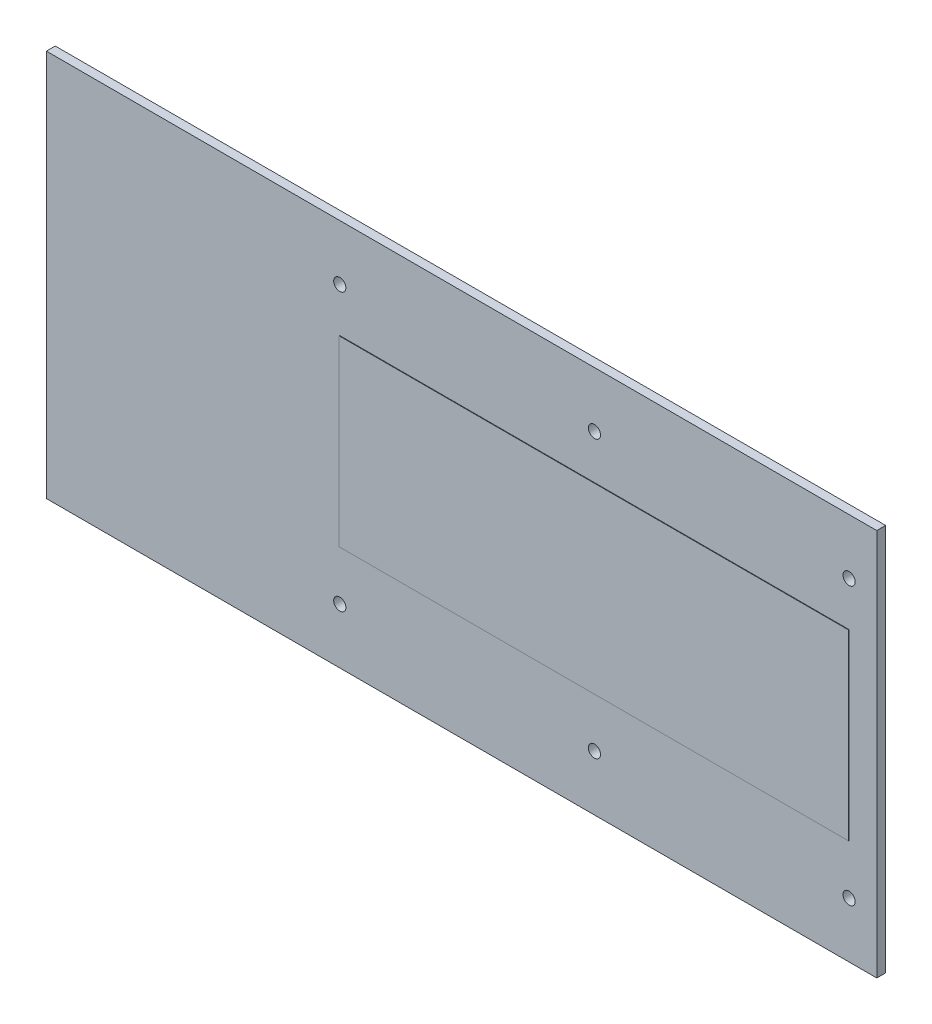
ISO-10303-21;
HEADER;
FILE_DESCRIPTION(('STEP AP214'),'2;1');
FILE_NAME('part.step','',(''),(''),'','','');
FILE_SCHEMA(('AUTOMOTIVE_DESIGN { 1 0 10303 214 1 1 1 1 }'));
ENDSEC;
DATA;
#1=APPLICATION_CONTEXT('core data for automotive mechanical design processes');
#2=APPLICATION_PROTOCOL_DEFINITION('international standard','automotive_design',2000,#1);
#3=PRODUCT_CONTEXT('',#1,'mechanical');
#4=PRODUCT('Part','Part','',(#3));
#5=PRODUCT_RELATED_PRODUCT_CATEGORY('part','',(#4));
#6=PRODUCT_DEFINITION_FORMATION('','',#4);
#7=PRODUCT_DEFINITION_CONTEXT('part definition',#1,'design');
#8=PRODUCT_DEFINITION('design','',#6,#7);
#9=PRODUCT_DEFINITION_SHAPE('','',#8);
#10=(LENGTH_UNIT() NAMED_UNIT(*) SI_UNIT(.MILLI.,.METRE.));
#11=(NAMED_UNIT(*) PLANE_ANGLE_UNIT() SI_UNIT($,.RADIAN.));
#12=(NAMED_UNIT(*) SI_UNIT($,.STERADIAN.) SOLID_ANGLE_UNIT());
#13=UNCERTAINTY_MEASURE_WITH_UNIT(LENGTH_MEASURE(1.E-05),#10,'distance_accuracy_value','');
#14=(GEOMETRIC_REPRESENTATION_CONTEXT(3) GLOBAL_UNCERTAINTY_ASSIGNED_CONTEXT((#13)) GLOBAL_UNIT_ASSIGNED_CONTEXT((#10,
#11,#12)) REPRESENTATION_CONTEXT('',''));
#15=CARTESIAN_POINT('',(0.,0.,0.));
#16=DIRECTION('',(0.,0.,1.));
#17=DIRECTION('',(1.,0.,0.));
#18=AXIS2_PLACEMENT_3D('',#15,#16,#17);
#19=CARTESIAN_POINT('',(53.,52.,1.7));
#20=DIRECTION('',(1.,0.,0.));
#21=DIRECTION('',(0.,0.,-1.));
#22=AXIS2_PLACEMENT_3D('',#19,#20,#21);
#23=PLANE('',#22);
#24=DIRECTION('',(0.,-1.,0.));
#25=VECTOR('',#24,1.);
#26=CARTESIAN_POINT('',(53.,52.,1.6));
#27=LINE('',#26,#25);
#28=CARTESIAN_POINT('',(53.,52.,1.6));
#29=VERTEX_POINT('',#28);
#30=CARTESIAN_POINT('',(53.,19.,1.6));
#31=VERTEX_POINT('',#30);
#32=EDGE_CURVE('E108',#29,#31,#27,.T.);
#33=ORIENTED_EDGE('',*,*,#32,.T.);
#34=DIRECTION('',(0.,0.,-1.));
#35=VECTOR('',#34,1.);
#36=CARTESIAN_POINT('',(53.,19.,1.7));
#37=LINE('',#36,#35);
#38=CARTESIAN_POINT('',(53.,19.,1.7));
#39=VERTEX_POINT('',#38);
#40=EDGE_CURVE('E12',#39,#31,#37,.T.);
#41=ORIENTED_EDGE('',*,*,#40,.F.);
#42=DIRECTION('',(0.,-1.,0.));
#43=VECTOR('',#42,1.);
#44=CARTESIAN_POINT('',(53.,52.,1.7));
#45=LINE('',#44,#43);
#46=CARTESIAN_POINT('',(53.,52.,1.7));
#47=VERTEX_POINT('',#46);
#48=EDGE_CURVE('E96',#47,#39,#45,.T.);
#49=ORIENTED_EDGE('',*,*,#48,.F.);
#50=DIRECTION('',(0.,0.,-1.));
#51=VECTOR('',#50,1.);
#52=CARTESIAN_POINT('',(53.,52.,1.7));
#53=LINE('',#52,#51);
#54=EDGE_CURVE('E104',#47,#29,#53,.T.);
#55=ORIENTED_EDGE('',*,*,#54,.T.);
#56=EDGE_LOOP('',(#33,#41,#49,#55));
#57=FACE_BOUND('',#56,.T.);
#58=ADVANCED_FACE('F45',(#57),#23,.F.);
#59=CARTESIAN_POINT('',(53.,19.,1.7));
#60=DIRECTION('',(0.,1.,0.));
#61=DIRECTION('',(0.,0.,1.));
#62=AXIS2_PLACEMENT_3D('',#59,#60,#61);
#63=PLANE('',#62);
#64=DIRECTION('',(1.,0.,0.));
#65=VECTOR('',#64,1.);
#66=CARTESIAN_POINT('',(53.,19.,1.6));
#67=LINE('',#66,#65);
#68=CARTESIAN_POINT('',(145.,19.,1.6));
#69=VERTEX_POINT('',#68);
#70=EDGE_CURVE('E100',#31,#69,#67,.T.);
#71=ORIENTED_EDGE('',*,*,#70,.T.);
#72=DIRECTION('',(0.,0.,-1.));
#73=VECTOR('',#72,1.);
#74=CARTESIAN_POINT('',(145.,19.,1.7));
#75=LINE('',#74,#73);
#76=CARTESIAN_POINT('',(145.,19.,1.7));
#77=VERTEX_POINT('',#76);
#78=EDGE_CURVE('E53',#77,#69,#75,.T.);
#79=ORIENTED_EDGE('',*,*,#78,.F.);
#80=DIRECTION('',(1.,0.,0.));
#81=VECTOR('',#80,1.);
#82=CARTESIAN_POINT('',(53.,19.,1.7));
#83=LINE('',#82,#81);
#84=EDGE_CURVE('E91',#39,#77,#83,.T.);
#85=ORIENTED_EDGE('',*,*,#84,.F.);
#86=ORIENTED_EDGE('',*,*,#40,.T.);
#87=EDGE_LOOP('',(#71,#79,#85,#86));
#88=FACE_BOUND('',#87,.T.);
#89=ADVANCED_FACE('F99',(#88),#63,.F.);
#90=CARTESIAN_POINT('',(145.,52.,1.7));
#91=DIRECTION('',(-1.,0.,0.));
#92=DIRECTION('',(0.,0.,1.));
#93=AXIS2_PLACEMENT_3D('',#90,#91,#92);
#94=PLANE('',#93);
#95=DIRECTION('',(0.,1.,0.));
#96=VECTOR('',#95,1.);
#97=CARTESIAN_POINT('',(145.,52.,1.6));
#98=LINE('',#97,#96);
#99=CARTESIAN_POINT('',(145.,52.,1.6));
#100=VERTEX_POINT('',#99);
#101=EDGE_CURVE('E78',#69,#100,#98,.T.);
#102=ORIENTED_EDGE('',*,*,#101,.T.);
#103=DIRECTION('',(0.,0.,-1.));
#104=VECTOR('',#103,1.);
#105=CARTESIAN_POINT('',(145.,52.,1.7));
#106=LINE('',#105,#104);
#107=CARTESIAN_POINT('',(145.,52.,1.7));
#108=VERTEX_POINT('',#107);
#109=EDGE_CURVE('E101',#108,#100,#106,.T.);
#110=ORIENTED_EDGE('',*,*,#109,.F.);
#111=DIRECTION('',(0.,1.,0.));
#112=VECTOR('',#111,1.);
#113=CARTESIAN_POINT('',(145.,52.,1.7));
#114=LINE('',#113,#112);
#115=EDGE_CURVE('E94',#77,#108,#114,.T.);
#116=ORIENTED_EDGE('',*,*,#115,.F.);
#117=ORIENTED_EDGE('',*,*,#78,.T.);
#118=EDGE_LOOP('',(#102,#110,#116,#117));
#119=FACE_BOUND('',#118,.T.);
#120=ADVANCED_FACE('F102',(#119),#94,.F.);
#121=CARTESIAN_POINT('',(53.,52.,1.7));
#122=DIRECTION('',(0.,-1.,0.));
#123=DIRECTION('',(0.,0.,-1.));
#124=AXIS2_PLACEMENT_3D('',#121,#122,#123);
#125=PLANE('',#124);
#126=DIRECTION('',(-1.,0.,0.));
#127=VECTOR('',#126,1.);
#128=CARTESIAN_POINT('',(53.,52.,1.6));
#129=LINE('',#128,#127);
#130=EDGE_CURVE('E84',#100,#29,#129,.T.);
#131=ORIENTED_EDGE('',*,*,#130,.T.);
#132=ORIENTED_EDGE('',*,*,#54,.F.);
#133=DIRECTION('',(-1.,0.,0.));
#134=VECTOR('',#133,1.);
#135=CARTESIAN_POINT('',(53.,52.,1.7));
#136=LINE('',#135,#134);
#137=EDGE_CURVE('E61',#108,#47,#136,.T.);
#138=ORIENTED_EDGE('',*,*,#137,.F.);
#139=ORIENTED_EDGE('',*,*,#109,.T.);
#140=EDGE_LOOP('',(#131,#132,#138,#139));
#141=FACE_BOUND('',#140,.T.);
#142=ADVANCED_FACE('F115',(#141),#125,.F.);
#143=CARTESIAN_POINT('',(0.,0.,1.7));
#144=DIRECTION('',(0.,0.,1.));
#145=DIRECTION('',(1.,0.,0.));
#146=AXIS2_PLACEMENT_3D('',#143,#144,#145);
#147=PLANE('',#146);
#148=ORIENTED_EDGE('',*,*,#48,.T.);
#149=ORIENTED_EDGE('',*,*,#84,.T.);
#150=ORIENTED_EDGE('',*,*,#115,.T.);
#151=ORIENTED_EDGE('',*,*,#137,.T.);
#152=EDGE_LOOP('',(#148,#149,#150,#151));
#153=FACE_BOUND('',#152,.T.);
#154=ADVANCED_FACE('F92',(#153),#147,.T.);
#155=CARTESIAN_POINT('',(0.,0.,1.6));
#156=DIRECTION('',(0.,0.,1.));
#157=DIRECTION('',(1.,0.,0.));
#158=AXIS2_PLACEMENT_3D('',#155,#156,#157);
#159=PLANE('',#158);
#160=ORIENTED_EDGE('',*,*,#32,.F.);
#161=ORIENTED_EDGE('',*,*,#130,.F.);
#162=ORIENTED_EDGE('',*,*,#101,.F.);
#163=ORIENTED_EDGE('',*,*,#70,.F.);
#164=EDGE_LOOP('',(#160,#161,#162,#163));
#165=FACE_BOUND('',#164,.T.);
#166=ADVANCED_FACE('F118',(#165),#159,.F.);
#167=CLOSED_SHELL('',(#58,#89,#120,#142,#154,#166));
#168=MANIFOLD_SOLID_BREP('B2',#167);
#169=CARTESIAN_POINT('',(0.,0.,1.6));
#170=DIRECTION('',(0.,0.,-1.));
#171=DIRECTION('',(-1.,0.,0.));
#172=AXIS2_PLACEMENT_3D('',#169,#170,#171);
#173=PLANE('',#172);
#174=CARTESIAN_POINT('',(145.,60.,1.6));
#175=DIRECTION('',(0.,0.,1.));
#176=DIRECTION('',(1.,0.,0.));
#177=AXIS2_PLACEMENT_3D('',#174,#175,#176);
#178=CIRCLE('',#177,1.1);
#179=CARTESIAN_POINT('',(146.1,60.,1.6));
#180=VERTEX_POINT('',#179);
#181=EDGE_CURVE('E270',#180,#180,#178,.T.);
#182=ORIENTED_EDGE('',*,*,#181,.F.);
#183=EDGE_LOOP('',(#182));
#184=FACE_BOUND('',#183,.T.);
#185=CARTESIAN_POINT('',(145.,10.,1.6));
#186=DIRECTION('',(0.,0.,1.));
#187=DIRECTION('',(1.,0.,0.));
#188=AXIS2_PLACEMENT_3D('',#185,#186,#187);
#189=CIRCLE('',#188,1.1);
#190=CARTESIAN_POINT('',(146.1,10.,1.6));
#191=VERTEX_POINT('',#190);
#192=EDGE_CURVE('E276',#191,#191,#189,.T.);
#193=ORIENTED_EDGE('',*,*,#192,.F.);
#194=EDGE_LOOP('',(#193));
#195=FACE_BOUND('',#194,.T.);
#196=CARTESIAN_POINT('',(53.,60.,1.6));
#197=DIRECTION('',(0.,0.,1.));
#198=DIRECTION('',(1.,0.,0.));
#199=AXIS2_PLACEMENT_3D('',#196,#197,#198);
#200=CIRCLE('',#199,1.1);
#201=CARTESIAN_POINT('',(54.1,60.,1.6));
#202=VERTEX_POINT('',#201);
#203=EDGE_CURVE('E282',#202,#202,#200,.T.);
#204=ORIENTED_EDGE('',*,*,#203,.F.);
#205=EDGE_LOOP('',(#204));
#206=FACE_BOUND('',#205,.T.);
#207=CARTESIAN_POINT('',(99.,60.,1.6));
#208=DIRECTION('',(0.,0.,1.));
#209=DIRECTION('',(1.,0.,0.));
#210=AXIS2_PLACEMENT_3D('',#207,#208,#209);
#211=CIRCLE('',#210,1.1);
#212=CARTESIAN_POINT('',(100.1,60.,1.6));
#213=VERTEX_POINT('',#212);
#214=EDGE_CURVE('E288',#213,#213,#211,.T.);
#215=ORIENTED_EDGE('',*,*,#214,.F.);
#216=EDGE_LOOP('',(#215));
#217=FACE_BOUND('',#216,.T.);
#218=CARTESIAN_POINT('',(53.,10.,1.6));
#219=DIRECTION('',(0.,0.,1.));
#220=DIRECTION('',(1.,0.,0.));
#221=AXIS2_PLACEMENT_3D('',#218,#219,#220);
#222=CIRCLE('',#221,1.1);
#223=CARTESIAN_POINT('',(54.1,10.,1.6));
#224=VERTEX_POINT('',#223);
#225=EDGE_CURVE('E294',#224,#224,#222,.T.);
#226=ORIENTED_EDGE('',*,*,#225,.F.);
#227=EDGE_LOOP('',(#226));
#228=FACE_BOUND('',#227,.T.);
#229=CARTESIAN_POINT('',(99.,10.,1.6));
#230=DIRECTION('',(0.,0.,1.));
#231=DIRECTION('',(1.,0.,0.));
#232=AXIS2_PLACEMENT_3D('',#229,#230,#231);
#233=CIRCLE('',#232,1.1);
#234=CARTESIAN_POINT('',(100.1,10.,1.6));
#235=VERTEX_POINT('',#234);
#236=EDGE_CURVE('E300',#235,#235,#233,.T.);
#237=ORIENTED_EDGE('',*,*,#236,.F.);
#238=EDGE_LOOP('',(#237));
#239=FACE_BOUND('',#238,.T.);
#240=DIRECTION('',(-1.,0.,0.));
#241=VECTOR('',#240,1.);
#242=CARTESIAN_POINT('',(0.,70.,1.6));
#243=LINE('',#242,#241);
#244=CARTESIAN_POINT('',(150.,70.,1.6));
#245=VERTEX_POINT('',#244);
#246=CARTESIAN_POINT('',(0.,70.,1.6));
#247=VERTEX_POINT('',#246);
#248=EDGE_CURVE('E306',#245,#247,#243,.T.);
#249=ORIENTED_EDGE('',*,*,#248,.T.);
#250=DIRECTION('',(0.,-1.,0.));
#251=VECTOR('',#250,1.);
#252=CARTESIAN_POINT('',(0.,47.,1.6));
#253=LINE('',#252,#251);
#254=CARTESIAN_POINT('',(0.,0.,1.6));
#255=VERTEX_POINT('',#254);
#256=EDGE_CURVE('E309',#247,#255,#253,.T.);
#257=ORIENTED_EDGE('',*,*,#256,.T.);
#258=DIRECTION('',(1.,0.,0.));
#259=VECTOR('',#258,1.);
#260=CARTESIAN_POINT('',(46.,0.,1.6));
#261=LINE('',#260,#259);
#262=CARTESIAN_POINT('',(150.,0.,1.6));
#263=VERTEX_POINT('',#262);
#264=EDGE_CURVE('E312',#255,#263,#261,.T.);
#265=ORIENTED_EDGE('',*,*,#264,.T.);
#266=DIRECTION('',(0.,1.,0.));
#267=VECTOR('',#266,1.);
#268=CARTESIAN_POINT('',(150.,70.,1.6));
#269=LINE('',#268,#267);
#270=EDGE_CURVE('E314',#263,#245,#269,.T.);
#271=ORIENTED_EDGE('',*,*,#270,.T.);
#272=EDGE_LOOP('',(#249,#257,#265,#271));
#273=FACE_BOUND('',#272,.T.);
#274=DIRECTION('',(1.,0.,0.));
#275=VECTOR('',#274,1.);
#276=CARTESIAN_POINT('',(53.,19.,1.6));
#277=LINE('',#276,#275);
#278=CARTESIAN_POINT('',(53.,19.,1.6));
#279=VERTEX_POINT('',#278);
#280=CARTESIAN_POINT('',(145.,19.,1.6));
#281=VERTEX_POINT('',#280);
#282=EDGE_CURVE('E234',#279,#281,#277,.T.);
#283=ORIENTED_EDGE('',*,*,#282,.F.);
#284=DIRECTION('',(0.,-1.,0.));
#285=VECTOR('',#284,1.);
#286=CARTESIAN_POINT('',(53.,52.,1.6));
#287=LINE('',#286,#285);
#288=CARTESIAN_POINT('',(53.,52.,1.6));
#289=VERTEX_POINT('',#288);
#290=EDGE_CURVE('E256',#289,#279,#287,.T.);
#291=ORIENTED_EDGE('',*,*,#290,.F.);
#292=DIRECTION('',(-1.,0.,0.));
#293=VECTOR('',#292,1.);
#294=CARTESIAN_POINT('',(145.,52.,1.6));
#295=LINE('',#294,#293);
#296=CARTESIAN_POINT('',(145.,52.,1.6));
#297=VERTEX_POINT('',#296);
#298=EDGE_CURVE('E254',#297,#289,#295,.T.);
#299=ORIENTED_EDGE('',*,*,#298,.F.);
#300=DIRECTION('',(0.,1.,0.));
#301=VECTOR('',#300,1.);
#302=CARTESIAN_POINT('',(145.,19.,1.6));
#303=LINE('',#302,#301);
#304=EDGE_CURVE('E242',#281,#297,#303,.T.);
#305=ORIENTED_EDGE('',*,*,#304,.F.);
#306=EDGE_LOOP('',(#283,#291,#299,#305));
#307=FACE_BOUND('',#306,.T.);
#308=ADVANCED_FACE('F169',(#184,#195,#206,#217,#228,#239,#273,#307),#173,.F.);
#309=CARTESIAN_POINT('',(0.,0.,0.));
#310=DIRECTION('',(0.,0.,-1.));
#311=DIRECTION('',(-1.,0.,0.));
#312=AXIS2_PLACEMENT_3D('',#309,#310,#311);
#313=PLANE('',#312);
#314=CARTESIAN_POINT('',(145.,10.,0.));
#315=DIRECTION('',(0.,0.,1.));
#316=DIRECTION('',(1.,0.,0.));
#317=AXIS2_PLACEMENT_3D('',#314,#315,#316);
#318=CIRCLE('',#317,1.1);
#319=CARTESIAN_POINT('',(146.1,10.,0.));
#320=VERTEX_POINT('',#319);
#321=EDGE_CURVE('E273',#320,#320,#318,.T.);
#322=ORIENTED_EDGE('',*,*,#321,.T.);
#323=EDGE_LOOP('',(#322));
#324=FACE_BOUND('',#323,.T.);
#325=CARTESIAN_POINT('',(99.,60.,0.));
#326=DIRECTION('',(0.,0.,1.));
#327=DIRECTION('',(1.,0.,0.));
#328=AXIS2_PLACEMENT_3D('',#325,#326,#327);
#329=CIRCLE('',#328,1.1);
#330=CARTESIAN_POINT('',(100.1,60.,0.));
#331=VERTEX_POINT('',#330);
#332=EDGE_CURVE('E285',#331,#331,#329,.T.);
#333=ORIENTED_EDGE('',*,*,#332,.T.);
#334=EDGE_LOOP('',(#333));
#335=FACE_BOUND('',#334,.T.);
#336=CARTESIAN_POINT('',(99.,10.,0.));
#337=DIRECTION('',(0.,0.,1.));
#338=DIRECTION('',(1.,0.,0.));
#339=AXIS2_PLACEMENT_3D('',#336,#337,#338);
#340=CIRCLE('',#339,1.1);
#341=CARTESIAN_POINT('',(100.1,10.,0.));
#342=VERTEX_POINT('',#341);
#343=EDGE_CURVE('E297',#342,#342,#340,.T.);
#344=ORIENTED_EDGE('',*,*,#343,.T.);
#345=EDGE_LOOP('',(#344));
#346=FACE_BOUND('',#345,.T.);
#347=DIRECTION('',(0.,-1.,0.));
#348=VECTOR('',#347,1.);
#349=CARTESIAN_POINT('',(0.,0.,0.));
#350=LINE('',#349,#348);
#351=CARTESIAN_POINT('',(0.,70.,0.));
#352=VERTEX_POINT('',#351);
#353=CARTESIAN_POINT('',(0.,0.,0.));
#354=VERTEX_POINT('',#353);
#355=EDGE_CURVE('E303',#352,#354,#350,.T.);
#356=ORIENTED_EDGE('',*,*,#355,.F.);
#357=DIRECTION('',(-1.,0.,0.));
#358=VECTOR('',#357,1.);
#359=CARTESIAN_POINT('',(48.,70.,0.));
#360=LINE('',#359,#358);
#361=CARTESIAN_POINT('',(150.,70.,0.));
#362=VERTEX_POINT('',#361);
#363=EDGE_CURVE('E310',#362,#352,#360,.T.);
#364=ORIENTED_EDGE('',*,*,#363,.F.);
#365=DIRECTION('',(0.,1.,0.));
#366=VECTOR('',#365,1.);
#367=CARTESIAN_POINT('',(150.,70.,0.));
#368=LINE('',#367,#366);
#369=CARTESIAN_POINT('',(150.,0.,0.));
#370=VERTEX_POINT('',#369);
#371=EDGE_CURVE('E322',#370,#362,#368,.T.);
#372=ORIENTED_EDGE('',*,*,#371,.F.);
#373=DIRECTION('',(1.,0.,0.));
#374=VECTOR('',#373,1.);
#375=CARTESIAN_POINT('',(150.,0.,0.));
#376=LINE('',#375,#374);
#377=EDGE_CURVE('E320',#354,#370,#376,.T.);
#378=ORIENTED_EDGE('',*,*,#377,.F.);
#379=EDGE_LOOP('',(#356,#364,#372,#378));
#380=FACE_BOUND('',#379,.T.);
#381=CARTESIAN_POINT('',(53.,10.,0.));
#382=DIRECTION('',(0.,0.,1.));
#383=DIRECTION('',(1.,0.,0.));
#384=AXIS2_PLACEMENT_3D('',#381,#382,#383);
#385=CIRCLE('',#384,1.1);
#386=CARTESIAN_POINT('',(54.1,10.,0.));
#387=VERTEX_POINT('',#386);
#388=EDGE_CURVE('E291',#387,#387,#385,.T.);
#389=ORIENTED_EDGE('',*,*,#388,.T.);
#390=EDGE_LOOP('',(#389));
#391=FACE_BOUND('',#390,.T.);
#392=CARTESIAN_POINT('',(53.,60.,0.));
#393=DIRECTION('',(0.,0.,1.));
#394=DIRECTION('',(1.,0.,0.));
#395=AXIS2_PLACEMENT_3D('',#392,#393,#394);
#396=CIRCLE('',#395,1.1);
#397=CARTESIAN_POINT('',(54.1,60.,0.));
#398=VERTEX_POINT('',#397);
#399=EDGE_CURVE('E279',#398,#398,#396,.T.);
#400=ORIENTED_EDGE('',*,*,#399,.T.);
#401=EDGE_LOOP('',(#400));
#402=FACE_BOUND('',#401,.T.);
#403=CARTESIAN_POINT('',(145.,60.,0.));
#404=DIRECTION('',(0.,0.,1.));
#405=DIRECTION('',(1.,0.,0.));
#406=AXIS2_PLACEMENT_3D('',#403,#404,#405);
#407=CIRCLE('',#406,1.1);
#408=CARTESIAN_POINT('',(146.1,60.,0.));
#409=VERTEX_POINT('',#408);
#410=EDGE_CURVE('E250',#409,#409,#407,.T.);
#411=ORIENTED_EDGE('',*,*,#410,.T.);
#412=EDGE_LOOP('',(#411));
#413=FACE_BOUND('',#412,.T.);
#414=DIRECTION('',(0.,-1.,0.));
#415=VECTOR('',#414,1.);
#416=CARTESIAN_POINT('',(53.,52.,0.));
#417=LINE('',#416,#415);
#418=CARTESIAN_POINT('',(53.,52.,0.));
#419=VERTEX_POINT('',#418);
#420=CARTESIAN_POINT('',(53.,19.,0.));
#421=VERTEX_POINT('',#420);
#422=EDGE_CURVE('E243',#419,#421,#417,.T.);
#423=ORIENTED_EDGE('',*,*,#422,.T.);
#424=DIRECTION('',(1.,0.,0.));
#425=VECTOR('',#424,1.);
#426=CARTESIAN_POINT('',(53.,19.,0.));
#427=LINE('',#426,#425);
#428=CARTESIAN_POINT('',(145.,19.,0.));
#429=VERTEX_POINT('',#428);
#430=EDGE_CURVE('E192',#421,#429,#427,.T.);
#431=ORIENTED_EDGE('',*,*,#430,.T.);
#432=DIRECTION('',(0.,1.,0.));
#433=VECTOR('',#432,1.);
#434=CARTESIAN_POINT('',(145.,19.,0.));
#435=LINE('',#434,#433);
#436=CARTESIAN_POINT('',(145.,52.,0.));
#437=VERTEX_POINT('',#436);
#438=EDGE_CURVE('E249',#429,#437,#435,.T.);
#439=ORIENTED_EDGE('',*,*,#438,.T.);
#440=DIRECTION('',(-1.,0.,0.));
#441=VECTOR('',#440,1.);
#442=CARTESIAN_POINT('',(145.,52.,0.));
#443=LINE('',#442,#441);
#444=EDGE_CURVE('E262',#437,#419,#443,.T.);
#445=ORIENTED_EDGE('',*,*,#444,.T.);
#446=EDGE_LOOP('',(#423,#431,#439,#445));
#447=FACE_BOUND('',#446,.T.);
#448=ADVANCED_FACE('F340',(#324,#335,#346,#380,#391,#402,#413,#447),#313,.T.);
#449=CARTESIAN_POINT('',(0.,0.,1.6));
#450=DIRECTION('',(1.,0.,0.));
#451=DIRECTION('',(0.,0.,-1.));
#452=AXIS2_PLACEMENT_3D('',#449,#450,#451);
#453=PLANE('',#452);
#454=ORIENTED_EDGE('',*,*,#355,.T.);
#455=DIRECTION('',(0.,0.,-1.));
#456=VECTOR('',#455,1.);
#457=CARTESIAN_POINT('',(0.,0.,1.6));
#458=LINE('',#457,#456);
#459=EDGE_CURVE('E177',#255,#354,#458,.T.);
#460=ORIENTED_EDGE('',*,*,#459,.F.);
#461=ORIENTED_EDGE('',*,*,#256,.F.);
#462=DIRECTION('',(0.,0.,-1.));
#463=VECTOR('',#462,1.);
#464=CARTESIAN_POINT('',(0.,70.,1.6));
#465=LINE('',#464,#463);
#466=EDGE_CURVE('E43',#247,#352,#465,.T.);
#467=ORIENTED_EDGE('',*,*,#466,.T.);
#468=EDGE_LOOP('',(#454,#460,#461,#467));
#469=FACE_BOUND('',#468,.T.);
#470=ADVANCED_FACE('F171',(#469),#453,.F.);
#471=CARTESIAN_POINT('',(150.,0.,1.6));
#472=DIRECTION('',(0.,1.,0.));
#473=DIRECTION('',(0.,0.,1.));
#474=AXIS2_PLACEMENT_3D('',#471,#472,#473);
#475=PLANE('',#474);
#476=ORIENTED_EDGE('',*,*,#377,.T.);
#477=DIRECTION('',(0.,0.,-1.));
#478=VECTOR('',#477,1.);
#479=CARTESIAN_POINT('',(150.,0.,1.6));
#480=LINE('',#479,#478);
#481=EDGE_CURVE('E328',#263,#370,#480,.T.);
#482=ORIENTED_EDGE('',*,*,#481,.F.);
#483=ORIENTED_EDGE('',*,*,#264,.F.);
#484=ORIENTED_EDGE('',*,*,#459,.T.);
#485=EDGE_LOOP('',(#476,#482,#483,#484));
#486=FACE_BOUND('',#485,.T.);
#487=ADVANCED_FACE('F334',(#486),#475,.F.);
#488=CARTESIAN_POINT('',(150.,70.,1.6));
#489=DIRECTION('',(-1.,0.,0.));
#490=DIRECTION('',(0.,0.,1.));
#491=AXIS2_PLACEMENT_3D('',#488,#489,#490);
#492=PLANE('',#491);
#493=ORIENTED_EDGE('',*,*,#371,.T.);
#494=DIRECTION('',(0.,0.,-1.));
#495=VECTOR('',#494,1.);
#496=CARTESIAN_POINT('',(150.,70.,1.6));
#497=LINE('',#496,#495);
#498=EDGE_CURVE('E317',#245,#362,#497,.T.);
#499=ORIENTED_EDGE('',*,*,#498,.F.);
#500=ORIENTED_EDGE('',*,*,#270,.F.);
#501=ORIENTED_EDGE('',*,*,#481,.T.);
#502=EDGE_LOOP('',(#493,#499,#500,#501));
#503=FACE_BOUND('',#502,.T.);
#504=ADVANCED_FACE('F348',(#503),#492,.F.);
#505=CARTESIAN_POINT('',(48.,70.,1.6));
#506=DIRECTION('',(0.,-1.,0.));
#507=DIRECTION('',(0.,0.,-1.));
#508=AXIS2_PLACEMENT_3D('',#505,#506,#507);
#509=PLANE('',#508);
#510=ORIENTED_EDGE('',*,*,#363,.T.);
#511=ORIENTED_EDGE('',*,*,#466,.F.);
#512=ORIENTED_EDGE('',*,*,#248,.F.);
#513=ORIENTED_EDGE('',*,*,#498,.T.);
#514=EDGE_LOOP('',(#510,#511,#512,#513));
#515=FACE_BOUND('',#514,.T.);
#516=ADVANCED_FACE('F344',(#515),#509,.F.);
#517=CARTESIAN_POINT('',(99.,10.,1.6));
#518=DIRECTION('',(0.,0.,-1.));
#519=DIRECTION('',(-1.,0.,0.));
#520=AXIS2_PLACEMENT_3D('',#517,#518,#519);
#521=CYLINDRICAL_SURFACE('',#520,1.1);
#522=ORIENTED_EDGE('',*,*,#343,.F.);
#523=EDGE_LOOP('',(#522));
#524=FACE_BOUND('',#523,.T.);
#525=ORIENTED_EDGE('',*,*,#236,.T.);
#526=EDGE_LOOP('',(#525));
#527=FACE_BOUND('',#526,.T.);
#528=ADVANCED_FACE('F361',(#524,#527),#521,.F.);
#529=CARTESIAN_POINT('',(53.,10.,1.6));
#530=DIRECTION('',(0.,0.,-1.));
#531=DIRECTION('',(-1.,0.,0.));
#532=AXIS2_PLACEMENT_3D('',#529,#530,#531);
#533=CYLINDRICAL_SURFACE('',#532,1.1);
#534=ORIENTED_EDGE('',*,*,#388,.F.);
#535=EDGE_LOOP('',(#534));
#536=FACE_BOUND('',#535,.T.);
#537=ORIENTED_EDGE('',*,*,#225,.T.);
#538=EDGE_LOOP('',(#537));
#539=FACE_BOUND('',#538,.T.);
#540=ADVANCED_FACE('F433',(#536,#539),#533,.F.);
#541=CARTESIAN_POINT('',(99.,60.,1.6));
#542=DIRECTION('',(0.,0.,-1.));
#543=DIRECTION('',(-1.,0.,0.));
#544=AXIS2_PLACEMENT_3D('',#541,#542,#543);
#545=CYLINDRICAL_SURFACE('',#544,1.1);
#546=ORIENTED_EDGE('',*,*,#332,.F.);
#547=EDGE_LOOP('',(#546));
#548=FACE_BOUND('',#547,.T.);
#549=ORIENTED_EDGE('',*,*,#214,.T.);
#550=EDGE_LOOP('',(#549));
#551=FACE_BOUND('',#550,.T.);
#552=ADVANCED_FACE('F444',(#548,#551),#545,.F.);
#553=CARTESIAN_POINT('',(53.,60.,1.6));
#554=DIRECTION('',(0.,0.,-1.));
#555=DIRECTION('',(-1.,0.,0.));
#556=AXIS2_PLACEMENT_3D('',#553,#554,#555);
#557=CYLINDRICAL_SURFACE('',#556,1.1);
#558=ORIENTED_EDGE('',*,*,#399,.F.);
#559=EDGE_LOOP('',(#558));
#560=FACE_BOUND('',#559,.T.);
#561=ORIENTED_EDGE('',*,*,#203,.T.);
#562=EDGE_LOOP('',(#561));
#563=FACE_BOUND('',#562,.T.);
#564=ADVANCED_FACE('F455',(#560,#563),#557,.F.);
#565=CARTESIAN_POINT('',(145.,10.,1.6));
#566=DIRECTION('',(0.,0.,-1.));
#567=DIRECTION('',(-1.,0.,0.));
#568=AXIS2_PLACEMENT_3D('',#565,#566,#567);
#569=CYLINDRICAL_SURFACE('',#568,1.1);
#570=ORIENTED_EDGE('',*,*,#321,.F.);
#571=EDGE_LOOP('',(#570));
#572=FACE_BOUND('',#571,.T.);
#573=ORIENTED_EDGE('',*,*,#192,.T.);
#574=EDGE_LOOP('',(#573));
#575=FACE_BOUND('',#574,.T.);
#576=ADVANCED_FACE('F467',(#572,#575),#569,.F.);
#577=CARTESIAN_POINT('',(145.,60.,1.6));
#578=DIRECTION('',(0.,0.,-1.));
#579=DIRECTION('',(-1.,0.,0.));
#580=AXIS2_PLACEMENT_3D('',#577,#578,#579);
#581=CYLINDRICAL_SURFACE('',#580,1.1);
#582=ORIENTED_EDGE('',*,*,#410,.F.);
#583=EDGE_LOOP('',(#582));
#584=FACE_BOUND('',#583,.T.);
#585=ORIENTED_EDGE('',*,*,#181,.T.);
#586=EDGE_LOOP('',(#585));
#587=FACE_BOUND('',#586,.T.);
#588=ADVANCED_FACE('F479',(#584,#587),#581,.F.);
#589=CARTESIAN_POINT('',(53.,19.,1.6));
#590=DIRECTION('',(0.,1.,0.));
#591=DIRECTION('',(0.,0.,1.));
#592=AXIS2_PLACEMENT_3D('',#589,#590,#591);
#593=PLANE('',#592);
#594=ORIENTED_EDGE('',*,*,#430,.F.);
#595=DIRECTION('',(0.,0.,-1.));
#596=VECTOR('',#595,1.);
#597=CARTESIAN_POINT('',(53.,19.,1.6));
#598=LINE('',#597,#596);
#599=EDGE_CURVE('E238',#279,#421,#598,.T.);
#600=ORIENTED_EDGE('',*,*,#599,.F.);
#601=ORIENTED_EDGE('',*,*,#282,.T.);
#602=DIRECTION('',(0.,0.,-1.));
#603=VECTOR('',#602,1.);
#604=CARTESIAN_POINT('',(145.,19.,1.6));
#605=LINE('',#604,#603);
#606=EDGE_CURVE('E237',#281,#429,#605,.T.);
#607=ORIENTED_EDGE('',*,*,#606,.T.);
#608=EDGE_LOOP('',(#594,#600,#601,#607));
#609=FACE_BOUND('',#608,.T.);
#610=ADVANCED_FACE('F236',(#609),#593,.T.);
#611=CARTESIAN_POINT('',(145.,19.,1.6));
#612=DIRECTION('',(-1.,0.,0.));
#613=DIRECTION('',(0.,0.,1.));
#614=AXIS2_PLACEMENT_3D('',#611,#612,#613);
#615=PLANE('',#614);
#616=ORIENTED_EDGE('',*,*,#438,.F.);
#617=ORIENTED_EDGE('',*,*,#606,.F.);
#618=ORIENTED_EDGE('',*,*,#304,.T.);
#619=DIRECTION('',(0.,0.,-1.));
#620=VECTOR('',#619,1.);
#621=CARTESIAN_POINT('',(145.,52.,1.6));
#622=LINE('',#621,#620);
#623=EDGE_CURVE('E251',#297,#437,#622,.T.);
#624=ORIENTED_EDGE('',*,*,#623,.T.);
#625=EDGE_LOOP('',(#616,#617,#618,#624));
#626=FACE_BOUND('',#625,.T.);
#627=ADVANCED_FACE('F246',(#626),#615,.T.);
#628=CARTESIAN_POINT('',(145.,52.,1.6));
#629=DIRECTION('',(0.,-1.,0.));
#630=DIRECTION('',(0.,0.,-1.));
#631=AXIS2_PLACEMENT_3D('',#628,#629,#630);
#632=PLANE('',#631);
#633=ORIENTED_EDGE('',*,*,#444,.F.);
#634=ORIENTED_EDGE('',*,*,#623,.F.);
#635=ORIENTED_EDGE('',*,*,#298,.T.);
#636=DIRECTION('',(0.,0.,-1.));
#637=VECTOR('',#636,1.);
#638=CARTESIAN_POINT('',(53.,52.,1.6));
#639=LINE('',#638,#637);
#640=EDGE_CURVE('E184',#289,#419,#639,.T.);
#641=ORIENTED_EDGE('',*,*,#640,.T.);
#642=EDGE_LOOP('',(#633,#634,#635,#641));
#643=FACE_BOUND('',#642,.T.);
#644=ADVANCED_FACE('F509',(#643),#632,.T.);
#645=CARTESIAN_POINT('',(53.,52.,1.6));
#646=DIRECTION('',(1.,0.,0.));
#647=DIRECTION('',(0.,0.,-1.));
#648=AXIS2_PLACEMENT_3D('',#645,#646,#647);
#649=PLANE('',#648);
#650=ORIENTED_EDGE('',*,*,#422,.F.);
#651=ORIENTED_EDGE('',*,*,#640,.F.);
#652=ORIENTED_EDGE('',*,*,#290,.T.);
#653=ORIENTED_EDGE('',*,*,#599,.T.);
#654=EDGE_LOOP('',(#650,#651,#652,#653));
#655=FACE_BOUND('',#654,.T.);
#656=ADVANCED_FACE('F517',(#655),#649,.T.);
#657=CLOSED_SHELL('',(#308,#448,#470,#487,#504,#516,#528,#540,#552,#564,#576,#588,#610,#627,
#644,#656));
#658=MANIFOLD_SOLID_BREP('B6',#657);
#659=ADVANCED_BREP_SHAPE_REPRESENTATION('',(#18,#168,#658),#14);
#660=SHAPE_DEFINITION_REPRESENTATION(#9,#659);
ENDSEC;
END-ISO-10303-21;
